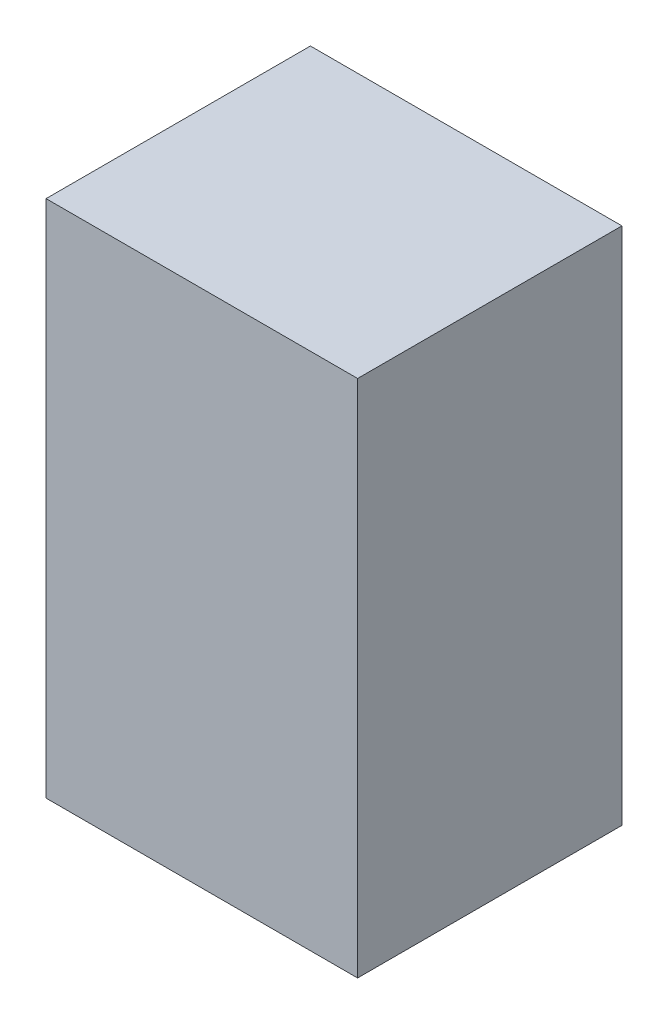
ISO-10303-21;
HEADER;
FILE_DESCRIPTION(('STEP AP214'),'2;1');
FILE_NAME('part.step','',(''),(''),'','','');
FILE_SCHEMA(('AUTOMOTIVE_DESIGN { 1 0 10303 214 1 1 1 1 }'));
ENDSEC;
DATA;
#1=APPLICATION_CONTEXT('core data for automotive mechanical design processes');
#2=APPLICATION_PROTOCOL_DEFINITION('international standard','automotive_design',2000,#1);
#3=PRODUCT_CONTEXT('',#1,'mechanical');
#4=PRODUCT('Part','Part','',(#3));
#5=PRODUCT_RELATED_PRODUCT_CATEGORY('part','',(#4));
#6=PRODUCT_DEFINITION_FORMATION('','',#4);
#7=PRODUCT_DEFINITION_CONTEXT('part definition',#1,'design');
#8=PRODUCT_DEFINITION('design','',#6,#7);
#9=PRODUCT_DEFINITION_SHAPE('','',#8);
#10=(LENGTH_UNIT() NAMED_UNIT(*) SI_UNIT(.MILLI.,.METRE.));
#11=(NAMED_UNIT(*) PLANE_ANGLE_UNIT() SI_UNIT($,.RADIAN.));
#12=(NAMED_UNIT(*) SI_UNIT($,.STERADIAN.) SOLID_ANGLE_UNIT());
#13=UNCERTAINTY_MEASURE_WITH_UNIT(LENGTH_MEASURE(1.E-05),#10,'distance_accuracy_value','');
#14=(GEOMETRIC_REPRESENTATION_CONTEXT(3) GLOBAL_UNCERTAINTY_ASSIGNED_CONTEXT((#13)) GLOBAL_UNIT_ASSIGNED_CONTEXT((#10,
#11,#12)) REPRESENTATION_CONTEXT('',''));
#15=CARTESIAN_POINT('',(0.,0.,0.));
#16=DIRECTION('',(0.,0.,1.));
#17=DIRECTION('',(1.,0.,0.));
#18=AXIS2_PLACEMENT_3D('',#15,#16,#17);
#19=CARTESIAN_POINT('',(419.1,1397.,355.6));
#20=DIRECTION('',(-1.,0.,0.));
#21=DIRECTION('',(0.,0.,1.));
#22=AXIS2_PLACEMENT_3D('',#19,#20,#21);
#23=PLANE('',#22);
#24=DIRECTION('',(0.,0.,-1.));
#25=VECTOR('',#24,1.);
#26=CARTESIAN_POINT('',(419.1,0.,355.6));
#27=LINE('',#26,#25);
#28=CARTESIAN_POINT('',(419.1,0.,355.6));
#29=VERTEX_POINT('',#28);
#30=CARTESIAN_POINT('',(419.1,0.,-355.6));
#31=VERTEX_POINT('',#30);
#32=EDGE_CURVE('E96',#29,#31,#27,.T.);
#33=ORIENTED_EDGE('',*,*,#32,.T.);
#34=DIRECTION('',(0.,-1.,0.));
#35=VECTOR('',#34,1.);
#36=CARTESIAN_POINT('',(419.1,1397.,-355.6));
#37=LINE('',#36,#35);
#38=CARTESIAN_POINT('',(419.1,1397.,-355.6));
#39=VERTEX_POINT('',#38);
#40=EDGE_CURVE('E11',#39,#31,#37,.T.);
#41=ORIENTED_EDGE('',*,*,#40,.F.);
#42=DIRECTION('',(0.,0.,-1.));
#43=VECTOR('',#42,1.);
#44=CARTESIAN_POINT('',(419.1,1397.,355.6));
#45=LINE('',#44,#43);
#46=CARTESIAN_POINT('',(419.1,1397.,355.6));
#47=VERTEX_POINT('',#46);
#48=EDGE_CURVE('E84',#47,#39,#45,.T.);
#49=ORIENTED_EDGE('',*,*,#48,.F.);
#50=DIRECTION('',(0.,-1.,0.));
#51=VECTOR('',#50,1.);
#52=CARTESIAN_POINT('',(419.1,1397.,355.6));
#53=LINE('',#52,#51);
#54=EDGE_CURVE('E92',#47,#29,#53,.T.);
#55=ORIENTED_EDGE('',*,*,#54,.T.);
#56=EDGE_LOOP('',(#33,#41,#49,#55));
#57=FACE_BOUND('',#56,.T.);
#58=ADVANCED_FACE('F33',(#57),#23,.F.);
#59=CARTESIAN_POINT('',(-419.1,1397.,-355.6));
#60=DIRECTION('',(0.,0.,1.));
#61=DIRECTION('',(1.,0.,0.));
#62=AXIS2_PLACEMENT_3D('',#59,#60,#61);
#63=PLANE('',#62);
#64=DIRECTION('',(-1.,0.,0.));
#65=VECTOR('',#64,1.);
#66=CARTESIAN_POINT('',(-419.1,0.,-355.6));
#67=LINE('',#66,#65);
#68=CARTESIAN_POINT('',(-419.1,0.,-355.6));
#69=VERTEX_POINT('',#68);
#70=EDGE_CURVE('E88',#31,#69,#67,.T.);
#71=ORIENTED_EDGE('',*,*,#70,.T.);
#72=DIRECTION('',(0.,-1.,0.));
#73=VECTOR('',#72,1.);
#74=CARTESIAN_POINT('',(-419.1,1397.,-355.6));
#75=LINE('',#74,#73);
#76=CARTESIAN_POINT('',(-419.1,1397.,-355.6));
#77=VERTEX_POINT('',#76);
#78=EDGE_CURVE('E41',#77,#69,#75,.T.);
#79=ORIENTED_EDGE('',*,*,#78,.F.);
#80=DIRECTION('',(-1.,0.,0.));
#81=VECTOR('',#80,1.);
#82=CARTESIAN_POINT('',(-419.1,1397.,-355.6));
#83=LINE('',#82,#81);
#84=EDGE_CURVE('E79',#39,#77,#83,.T.);
#85=ORIENTED_EDGE('',*,*,#84,.F.);
#86=ORIENTED_EDGE('',*,*,#40,.T.);
#87=EDGE_LOOP('',(#71,#79,#85,#86));
#88=FACE_BOUND('',#87,.T.);
#89=ADVANCED_FACE('F87',(#88),#63,.F.);
#90=CARTESIAN_POINT('',(-419.1,1397.,355.6));
#91=DIRECTION('',(1.,0.,0.));
#92=DIRECTION('',(0.,0.,-1.));
#93=AXIS2_PLACEMENT_3D('',#90,#91,#92);
#94=PLANE('',#93);
#95=DIRECTION('',(0.,0.,1.));
#96=VECTOR('',#95,1.);
#97=CARTESIAN_POINT('',(-419.1,0.,355.6));
#98=LINE('',#97,#96);
#99=CARTESIAN_POINT('',(-419.1,0.,355.6));
#100=VERTEX_POINT('',#99);
#101=EDGE_CURVE('E66',#69,#100,#98,.T.);
#102=ORIENTED_EDGE('',*,*,#101,.T.);
#103=DIRECTION('',(0.,-1.,0.));
#104=VECTOR('',#103,1.);
#105=CARTESIAN_POINT('',(-419.1,1397.,355.6));
#106=LINE('',#105,#104);
#107=CARTESIAN_POINT('',(-419.1,1397.,355.6));
#108=VERTEX_POINT('',#107);
#109=EDGE_CURVE('E89',#108,#100,#106,.T.);
#110=ORIENTED_EDGE('',*,*,#109,.F.);
#111=DIRECTION('',(0.,0.,1.));
#112=VECTOR('',#111,1.);
#113=CARTESIAN_POINT('',(-419.1,1397.,355.6));
#114=LINE('',#113,#112);
#115=EDGE_CURVE('E82',#77,#108,#114,.T.);
#116=ORIENTED_EDGE('',*,*,#115,.F.);
#117=ORIENTED_EDGE('',*,*,#78,.T.);
#118=EDGE_LOOP('',(#102,#110,#116,#117));
#119=FACE_BOUND('',#118,.T.);
#120=ADVANCED_FACE('F90',(#119),#94,.F.);
#121=CARTESIAN_POINT('',(-419.1,1397.,355.6));
#122=DIRECTION('',(0.,0.,-1.));
#123=DIRECTION('',(-1.,0.,0.));
#124=AXIS2_PLACEMENT_3D('',#121,#122,#123);
#125=PLANE('',#124);
#126=DIRECTION('',(1.,0.,0.));
#127=VECTOR('',#126,1.);
#128=CARTESIAN_POINT('',(-419.1,0.,355.6));
#129=LINE('',#128,#127);
#130=EDGE_CURVE('E72',#100,#29,#129,.T.);
#131=ORIENTED_EDGE('',*,*,#130,.T.);
#132=ORIENTED_EDGE('',*,*,#54,.F.);
#133=DIRECTION('',(1.,0.,0.));
#134=VECTOR('',#133,1.);
#135=CARTESIAN_POINT('',(-419.1,1397.,355.6));
#136=LINE('',#135,#134);
#137=EDGE_CURVE('E49',#108,#47,#136,.T.);
#138=ORIENTED_EDGE('',*,*,#137,.F.);
#139=ORIENTED_EDGE('',*,*,#109,.T.);
#140=EDGE_LOOP('',(#131,#132,#138,#139));
#141=FACE_BOUND('',#140,.T.);
#142=ADVANCED_FACE('F103',(#141),#125,.F.);
#143=CARTESIAN_POINT('',(0.,1397.,0.));
#144=DIRECTION('',(0.,-1.,0.));
#145=DIRECTION('',(0.,0.,-1.));
#146=AXIS2_PLACEMENT_3D('',#143,#144,#145);
#147=PLANE('',#146);
#148=ORIENTED_EDGE('',*,*,#48,.T.);
#149=ORIENTED_EDGE('',*,*,#84,.T.);
#150=ORIENTED_EDGE('',*,*,#115,.T.);
#151=ORIENTED_EDGE('',*,*,#137,.T.);
#152=EDGE_LOOP('',(#148,#149,#150,#151));
#153=FACE_BOUND('',#152,.T.);
#154=ADVANCED_FACE('F80',(#153),#147,.F.);
#155=CARTESIAN_POINT('',(0.,0.,0.));
#156=DIRECTION('',(0.,-1.,0.));
#157=DIRECTION('',(0.,0.,-1.));
#158=AXIS2_PLACEMENT_3D('',#155,#156,#157);
#159=PLANE('',#158);
#160=ORIENTED_EDGE('',*,*,#32,.F.);
#161=ORIENTED_EDGE('',*,*,#130,.F.);
#162=ORIENTED_EDGE('',*,*,#101,.F.);
#163=ORIENTED_EDGE('',*,*,#70,.F.);
#164=EDGE_LOOP('',(#160,#161,#162,#163));
#165=FACE_BOUND('',#164,.T.);
#166=ADVANCED_FACE('F106',(#165),#159,.T.);
#167=CLOSED_SHELL('',(#58,#89,#120,#142,#154,#166));
#168=MANIFOLD_SOLID_BREP('B2',#167);
#169=ADVANCED_BREP_SHAPE_REPRESENTATION('',(#18,#168),#14);
#170=SHAPE_DEFINITION_REPRESENTATION(#9,#169);
ENDSEC;
END-ISO-10303-21;
